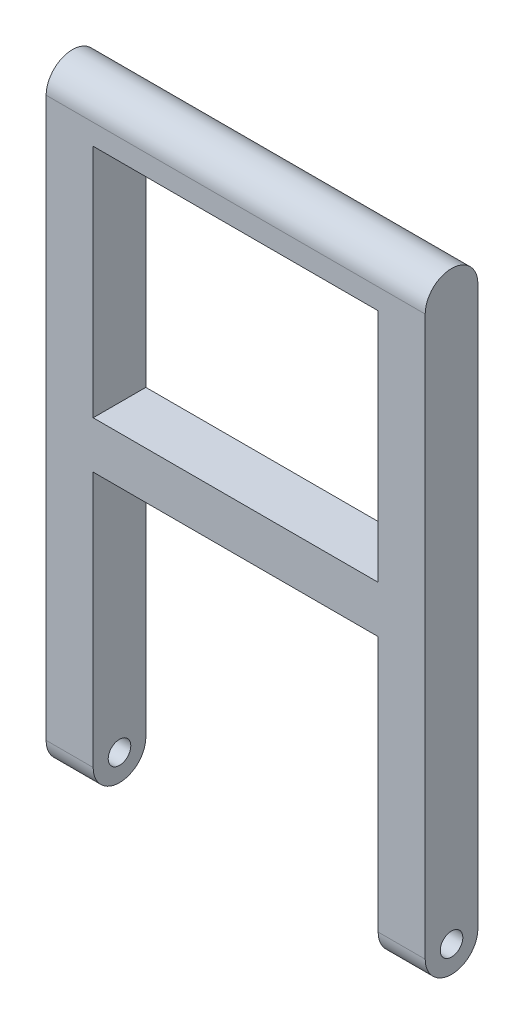
ISO-10303-21;
HEADER;
FILE_DESCRIPTION(('STEP AP214'),'2;1');
FILE_NAME('part.step','',(''),(''),'','','');
FILE_SCHEMA(('AUTOMOTIVE_DESIGN { 1 0 10303 214 1 1 1 1 }'));
ENDSEC;
DATA;
#1=APPLICATION_CONTEXT('core data for automotive mechanical design processes');
#2=APPLICATION_PROTOCOL_DEFINITION('international standard','automotive_design',2000,#1);
#3=PRODUCT_CONTEXT('',#1,'mechanical');
#4=PRODUCT('Part','Part','',(#3));
#5=PRODUCT_RELATED_PRODUCT_CATEGORY('part','',(#4));
#6=PRODUCT_DEFINITION_FORMATION('','',#4);
#7=PRODUCT_DEFINITION_CONTEXT('part definition',#1,'design');
#8=PRODUCT_DEFINITION('design','',#6,#7);
#9=PRODUCT_DEFINITION_SHAPE('','',#8);
#10=(LENGTH_UNIT() NAMED_UNIT(*) SI_UNIT(.MILLI.,.METRE.));
#11=(NAMED_UNIT(*) PLANE_ANGLE_UNIT() SI_UNIT($,.RADIAN.));
#12=(NAMED_UNIT(*) SI_UNIT($,.STERADIAN.) SOLID_ANGLE_UNIT());
#13=UNCERTAINTY_MEASURE_WITH_UNIT(LENGTH_MEASURE(1.E-05),#10,'distance_accuracy_value','');
#14=(GEOMETRIC_REPRESENTATION_CONTEXT(3) GLOBAL_UNCERTAINTY_ASSIGNED_CONTEXT((#13)) GLOBAL_UNIT_ASSIGNED_CONTEXT((#10,
#11,#12)) REPRESENTATION_CONTEXT('',''));
#15=CARTESIAN_POINT('',(0.,0.,0.));
#16=DIRECTION('',(0.,0.,1.));
#17=DIRECTION('',(1.,0.,0.));
#18=AXIS2_PLACEMENT_3D('',#15,#16,#17);
#19=CARTESIAN_POINT('',(40.3,0.,5.6));
#20=DIRECTION('',(1.,0.,0.));
#21=DIRECTION('',(0.,0.,-1.));
#22=AXIS2_PLACEMENT_3D('',#19,#20,#21);
#23=PLANE('',#22);
#24=CARTESIAN_POINT('',(40.3,2.8,2.8));
#25=DIRECTION('',(-1.,0.,0.));
#26=DIRECTION('',(0.,0.,1.));
#27=AXIS2_PLACEMENT_3D('',#24,#25,#26);
#28=CIRCLE('',#27,1.2);
#29=CARTESIAN_POINT('',(40.3,2.8,4.));
#30=VERTEX_POINT('',#29);
#31=EDGE_CURVE('E322',#30,#30,#28,.T.);
#32=ORIENTED_EDGE('',*,*,#31,.T.);
#33=EDGE_LOOP('',(#32));
#34=FACE_BOUND('',#33,.T.);
#35=DIRECTION('',(0.,-1.,0.));
#36=VECTOR('',#35,1.);
#37=CARTESIAN_POINT('',(40.3,0.,0.));
#38=LINE('',#37,#36);
#39=CARTESIAN_POINT('',(40.3,62.2,0.));
#40=VERTEX_POINT('',#39);
#41=CARTESIAN_POINT('',(40.3,2.8,0.));
#42=VERTEX_POINT('',#41);
#43=EDGE_CURVE('E192',#40,#42,#38,.T.);
#44=ORIENTED_EDGE('',*,*,#43,.F.);
#45=CARTESIAN_POINT('',(40.3,62.2,2.8));
#46=DIRECTION('',(-1.,0.,0.));
#47=DIRECTION('',(0.,0.,1.));
#48=AXIS2_PLACEMENT_3D('',#45,#46,#47);
#49=CIRCLE('',#48,2.8);
#50=CARTESIAN_POINT('',(40.3,62.2,5.6));
#51=VERTEX_POINT('',#50);
#52=EDGE_CURVE('E181',#51,#40,#49,.T.);
#53=ORIENTED_EDGE('',*,*,#52,.F.);
#54=DIRECTION('',(0.,-1.,0.));
#55=VECTOR('',#54,1.);
#56=CARTESIAN_POINT('',(40.3,0.,5.6));
#57=LINE('',#56,#55);
#58=CARTESIAN_POINT('',(40.3,2.8,5.6));
#59=VERTEX_POINT('',#58);
#60=EDGE_CURVE('E116',#51,#59,#57,.T.);
#61=ORIENTED_EDGE('',*,*,#60,.T.);
#62=CARTESIAN_POINT('',(40.3,2.8,2.8));
#63=DIRECTION('',(-1.,0.,0.));
#64=DIRECTION('',(0.,0.,1.));
#65=AXIS2_PLACEMENT_3D('',#62,#63,#64);
#66=CIRCLE('',#65,2.8);
#67=EDGE_CURVE('E196',#42,#59,#66,.T.);
#68=ORIENTED_EDGE('',*,*,#67,.F.);
#69=EDGE_LOOP('',(#44,#53,#61,#68));
#70=FACE_BOUND('',#69,.T.);
#71=ADVANCED_FACE('F93',(#34,#70),#23,.T.);
#72=CARTESIAN_POINT('',(0.,0.,5.6));
#73=DIRECTION('',(-1.,0.,0.));
#74=DIRECTION('',(0.,0.,1.));
#75=AXIS2_PLACEMENT_3D('',#72,#73,#74);
#76=PLANE('',#75);
#77=CARTESIAN_POINT('',(0.,2.8,2.8));
#78=DIRECTION('',(-1.,0.,0.));
#79=DIRECTION('',(0.,0.,1.));
#80=AXIS2_PLACEMENT_3D('',#77,#78,#79);
#81=CIRCLE('',#80,1.2);
#82=CARTESIAN_POINT('',(0.,2.8,4.));
#83=VERTEX_POINT('',#82);
#84=EDGE_CURVE('E325',#83,#83,#81,.T.);
#85=ORIENTED_EDGE('',*,*,#84,.F.);
#86=EDGE_LOOP('',(#85));
#87=FACE_BOUND('',#86,.T.);
#88=CARTESIAN_POINT('',(0.,62.2,2.8));
#89=DIRECTION('',(-1.,0.,0.));
#90=DIRECTION('',(0.,0.,1.));
#91=AXIS2_PLACEMENT_3D('',#88,#89,#90);
#92=CIRCLE('',#91,2.8);
#93=CARTESIAN_POINT('',(0.,62.2,5.6));
#94=VERTEX_POINT('',#93);
#95=CARTESIAN_POINT('',(0.,62.2,0.));
#96=VERTEX_POINT('',#95);
#97=EDGE_CURVE('E108',#94,#96,#92,.T.);
#98=ORIENTED_EDGE('',*,*,#97,.T.);
#99=DIRECTION('',(0.,1.,0.));
#100=VECTOR('',#99,1.);
#101=CARTESIAN_POINT('',(0.,0.,0.));
#102=LINE('',#101,#100);
#103=CARTESIAN_POINT('',(0.,2.8,0.));
#104=VERTEX_POINT('',#103);
#105=EDGE_CURVE('E194',#104,#96,#102,.T.);
#106=ORIENTED_EDGE('',*,*,#105,.F.);
#107=CARTESIAN_POINT('',(0.,2.8,2.8));
#108=DIRECTION('',(-1.,0.,0.));
#109=DIRECTION('',(0.,0.,1.));
#110=AXIS2_PLACEMENT_3D('',#107,#108,#109);
#111=CIRCLE('',#110,2.8);
#112=CARTESIAN_POINT('',(0.,2.8,5.6));
#113=VERTEX_POINT('',#112);
#114=EDGE_CURVE('E231',#104,#113,#111,.T.);
#115=ORIENTED_EDGE('',*,*,#114,.T.);
#116=DIRECTION('',(0.,1.,0.));
#117=VECTOR('',#116,1.);
#118=CARTESIAN_POINT('',(0.,0.,5.6));
#119=LINE('',#118,#117);
#120=EDGE_CURVE('E240',#113,#94,#119,.T.);
#121=ORIENTED_EDGE('',*,*,#120,.T.);
#122=EDGE_LOOP('',(#98,#106,#115,#121));
#123=FACE_BOUND('',#122,.T.);
#124=ADVANCED_FACE('F239',(#87,#123),#76,.T.);
#125=CARTESIAN_POINT('',(0.,0.,0.));
#126=DIRECTION('',(0.,0.,1.));
#127=DIRECTION('',(1.,0.,0.));
#128=AXIS2_PLACEMENT_3D('',#125,#126,#127);
#129=PLANE('',#128);
#130=DIRECTION('',(1.,0.,0.));
#131=VECTOR('',#130,1.);
#132=CARTESIAN_POINT('',(0.,35.,0.));
#133=LINE('',#132,#131);
#134=CARTESIAN_POINT('',(5.00000000000001,35.,0.));
#135=VERTEX_POINT('',#134);
#136=CARTESIAN_POINT('',(35.3,35.,0.));
#137=VERTEX_POINT('',#136);
#138=EDGE_CURVE('E200',#135,#137,#133,.T.);
#139=ORIENTED_EDGE('',*,*,#138,.T.);
#140=DIRECTION('',(0.,1.,0.));
#141=VECTOR('',#140,1.);
#142=CARTESIAN_POINT('',(35.3,0.,0.));
#143=LINE('',#142,#141);
#144=CARTESIAN_POINT('',(35.3,60.,0.));
#145=VERTEX_POINT('',#144);
#146=EDGE_CURVE('E204',#137,#145,#143,.T.);
#147=ORIENTED_EDGE('',*,*,#146,.T.);
#148=DIRECTION('',(-1.,0.,0.));
#149=VECTOR('',#148,1.);
#150=CARTESIAN_POINT('',(0.,60.,0.));
#151=LINE('',#150,#149);
#152=CARTESIAN_POINT('',(5.,60.,0.));
#153=VERTEX_POINT('',#152);
#154=EDGE_CURVE('E210',#145,#153,#151,.T.);
#155=ORIENTED_EDGE('',*,*,#154,.T.);
#156=DIRECTION('',(0.,-1.,0.));
#157=VECTOR('',#156,1.);
#158=CARTESIAN_POINT('',(5.00000000000001,0.,0.));
#159=LINE('',#158,#157);
#160=EDGE_CURVE('E209',#153,#135,#159,.T.);
#161=ORIENTED_EDGE('',*,*,#160,.T.);
#162=EDGE_LOOP('',(#139,#147,#155,#161));
#163=FACE_BOUND('',#162,.T.);
#164=DIRECTION('',(-1.,0.,0.));
#165=VECTOR('',#164,1.);
#166=CARTESIAN_POINT('',(40.3,62.2,0.));
#167=LINE('',#166,#165);
#168=EDGE_CURVE('E184',#40,#96,#167,.T.);
#169=ORIENTED_EDGE('',*,*,#168,.F.);
#170=ORIENTED_EDGE('',*,*,#43,.T.);
#171=DIRECTION('',(-1.,0.,0.));
#172=VECTOR('',#171,1.);
#173=CARTESIAN_POINT('',(40.3,2.8,0.));
#174=LINE('',#173,#172);
#175=CARTESIAN_POINT('',(35.3,2.8,0.));
#176=VERTEX_POINT('',#175);
#177=EDGE_CURVE('E324',#42,#176,#174,.T.);
#178=ORIENTED_EDGE('',*,*,#177,.T.);
#179=CARTESIAN_POINT('',(35.3,30.,0.));
#180=VERTEX_POINT('',#179);
#181=EDGE_CURVE('E198',#176,#180,#143,.T.);
#182=ORIENTED_EDGE('',*,*,#181,.T.);
#183=DIRECTION('',(1.,0.,0.));
#184=VECTOR('',#183,1.);
#185=CARTESIAN_POINT('',(0.,30.,0.));
#186=LINE('',#185,#184);
#187=CARTESIAN_POINT('',(5.00000000000001,30.,0.));
#188=VERTEX_POINT('',#187);
#189=EDGE_CURVE('E202',#188,#180,#186,.T.);
#190=ORIENTED_EDGE('',*,*,#189,.F.);
#191=CARTESIAN_POINT('',(5.00000000000001,2.8,0.));
#192=VERTEX_POINT('',#191);
#193=EDGE_CURVE('E256',#188,#192,#159,.T.);
#194=ORIENTED_EDGE('',*,*,#193,.T.);
#195=DIRECTION('',(-1.,0.,0.));
#196=VECTOR('',#195,1.);
#197=CARTESIAN_POINT('',(40.3,2.8,0.));
#198=LINE('',#197,#196);
#199=EDGE_CURVE('E12',#192,#104,#198,.T.);
#200=ORIENTED_EDGE('',*,*,#199,.T.);
#201=ORIENTED_EDGE('',*,*,#105,.T.);
#202=EDGE_LOOP('',(#169,#170,#178,#182,#190,#194,#200,#201));
#203=FACE_BOUND('',#202,.T.);
#204=ADVANCED_FACE('F190',(#163,#203),#129,.F.);
#205=CARTESIAN_POINT('',(0.,0.,5.6));
#206=DIRECTION('',(0.,0.,1.));
#207=DIRECTION('',(1.,0.,0.));
#208=AXIS2_PLACEMENT_3D('',#205,#206,#207);
#209=PLANE('',#208);
#210=DIRECTION('',(1.,0.,0.));
#211=VECTOR('',#210,1.);
#212=CARTESIAN_POINT('',(0.,35.,5.6));
#213=LINE('',#212,#211);
#214=CARTESIAN_POINT('',(5.00000000000001,35.,5.6));
#215=VERTEX_POINT('',#214);
#216=CARTESIAN_POINT('',(35.3,35.,5.6));
#217=VERTEX_POINT('',#216);
#218=EDGE_CURVE('E244',#215,#217,#213,.T.);
#219=ORIENTED_EDGE('',*,*,#218,.F.);
#220=DIRECTION('',(0.,-1.,0.));
#221=VECTOR('',#220,1.);
#222=CARTESIAN_POINT('',(5.00000000000001,0.,5.6));
#223=LINE('',#222,#221);
#224=CARTESIAN_POINT('',(5.,60.,5.6));
#225=VERTEX_POINT('',#224);
#226=EDGE_CURVE('E247',#225,#215,#223,.T.);
#227=ORIENTED_EDGE('',*,*,#226,.F.);
#228=DIRECTION('',(-1.,0.,0.));
#229=VECTOR('',#228,1.);
#230=CARTESIAN_POINT('',(0.,60.,5.6));
#231=LINE('',#230,#229);
#232=CARTESIAN_POINT('',(35.3,60.,5.6));
#233=VERTEX_POINT('',#232);
#234=EDGE_CURVE('E253',#233,#225,#231,.T.);
#235=ORIENTED_EDGE('',*,*,#234,.F.);
#236=DIRECTION('',(0.,1.,0.));
#237=VECTOR('',#236,1.);
#238=CARTESIAN_POINT('',(35.3,0.,5.6));
#239=LINE('',#238,#237);
#240=EDGE_CURVE('E225',#217,#233,#239,.T.);
#241=ORIENTED_EDGE('',*,*,#240,.F.);
#242=EDGE_LOOP('',(#219,#227,#235,#241));
#243=FACE_BOUND('',#242,.T.);
#244=ORIENTED_EDGE('',*,*,#60,.F.);
#245=DIRECTION('',(-1.,0.,0.));
#246=VECTOR('',#245,1.);
#247=CARTESIAN_POINT('',(40.3,62.2,5.6));
#248=LINE('',#247,#246);
#249=EDGE_CURVE('E186',#51,#94,#248,.T.);
#250=ORIENTED_EDGE('',*,*,#249,.T.);
#251=ORIENTED_EDGE('',*,*,#120,.F.);
#252=DIRECTION('',(-1.,0.,0.));
#253=VECTOR('',#252,1.);
#254=CARTESIAN_POINT('',(40.3,2.8,5.6));
#255=LINE('',#254,#253);
#256=CARTESIAN_POINT('',(5.00000000000001,2.8,5.6));
#257=VERTEX_POINT('',#256);
#258=EDGE_CURVE('E101',#257,#113,#255,.T.);
#259=ORIENTED_EDGE('',*,*,#258,.F.);
#260=CARTESIAN_POINT('',(5.00000000000001,30.,5.6));
#261=VERTEX_POINT('',#260);
#262=EDGE_CURVE('E267',#261,#257,#223,.T.);
#263=ORIENTED_EDGE('',*,*,#262,.F.);
#264=DIRECTION('',(1.,0.,0.));
#265=VECTOR('',#264,1.);
#266=CARTESIAN_POINT('',(0.,30.,5.6));
#267=LINE('',#266,#265);
#268=CARTESIAN_POINT('',(35.3,30.,5.6));
#269=VERTEX_POINT('',#268);
#270=EDGE_CURVE('E276',#261,#269,#267,.T.);
#271=ORIENTED_EDGE('',*,*,#270,.T.);
#272=CARTESIAN_POINT('',(35.3,2.8,5.6));
#273=VERTEX_POINT('',#272);
#274=EDGE_CURVE('E249',#273,#269,#239,.T.);
#275=ORIENTED_EDGE('',*,*,#274,.F.);
#276=DIRECTION('',(-1.,0.,0.));
#277=VECTOR('',#276,1.);
#278=CARTESIAN_POINT('',(40.3,2.8,5.6));
#279=LINE('',#278,#277);
#280=EDGE_CURVE('E271',#59,#273,#279,.T.);
#281=ORIENTED_EDGE('',*,*,#280,.F.);
#282=EDGE_LOOP('',(#244,#250,#251,#259,#263,#271,#275,#281));
#283=FACE_BOUND('',#282,.T.);
#284=ADVANCED_FACE('F243',(#243,#283),#209,.T.);
#285=CARTESIAN_POINT('',(5.00000000000001,0.,5.6));
#286=DIRECTION('',(1.,0.,0.));
#287=DIRECTION('',(0.,1.,0.));
#288=AXIS2_PLACEMENT_3D('',#285,#286,#287);
#289=PLANE('',#288);
#290=CARTESIAN_POINT('',(5.00000000000001,2.8,2.8));
#291=DIRECTION('',(1.,0.,0.));
#292=DIRECTION('',(0.,1.,0.));
#293=AXIS2_PLACEMENT_3D('',#290,#291,#292);
#294=CIRCLE('',#293,1.2);
#295=CARTESIAN_POINT('',(5.00000000000001,4.,2.8));
#296=VERTEX_POINT('',#295);
#297=EDGE_CURVE('E241',#296,#296,#294,.T.);
#298=ORIENTED_EDGE('',*,*,#297,.F.);
#299=EDGE_LOOP('',(#298));
#300=FACE_BOUND('',#299,.T.);
#301=CARTESIAN_POINT('',(5.00000000000001,2.8,2.8));
#302=DIRECTION('',(1.,0.,0.));
#303=DIRECTION('',(0.,1.,0.));
#304=AXIS2_PLACEMENT_3D('',#301,#302,#303);
#305=CIRCLE('',#304,2.8);
#306=EDGE_CURVE('E232',#257,#192,#305,.T.);
#307=ORIENTED_EDGE('',*,*,#306,.T.);
#308=ORIENTED_EDGE('',*,*,#193,.F.);
#309=DIRECTION('',(0.,0.,-1.));
#310=VECTOR('',#309,1.);
#311=CARTESIAN_POINT('',(5.00000000000001,30.,5.6));
#312=LINE('',#311,#310);
#313=EDGE_CURVE('E216',#261,#188,#312,.T.);
#314=ORIENTED_EDGE('',*,*,#313,.F.);
#315=ORIENTED_EDGE('',*,*,#262,.T.);
#316=EDGE_LOOP('',(#307,#308,#314,#315));
#317=FACE_BOUND('',#316,.T.);
#318=ADVANCED_FACE('F266',(#300,#317),#289,.T.);
#319=CARTESIAN_POINT('',(35.3,0.,5.6));
#320=DIRECTION('',(-1.,0.,0.));
#321=DIRECTION('',(0.,-1.,0.));
#322=AXIS2_PLACEMENT_3D('',#319,#320,#321);
#323=PLANE('',#322);
#324=CARTESIAN_POINT('',(35.3,2.8,2.8));
#325=DIRECTION('',(-1.,0.,0.));
#326=DIRECTION('',(0.,-1.,0.));
#327=AXIS2_PLACEMENT_3D('',#324,#325,#326);
#328=CIRCLE('',#327,1.2);
#329=CARTESIAN_POINT('',(35.3,1.6,2.8));
#330=VERTEX_POINT('',#329);
#331=EDGE_CURVE('E327',#330,#330,#328,.T.);
#332=ORIENTED_EDGE('',*,*,#331,.F.);
#333=EDGE_LOOP('',(#332));
#334=FACE_BOUND('',#333,.T.);
#335=ORIENTED_EDGE('',*,*,#181,.F.);
#336=CARTESIAN_POINT('',(35.3,2.8,2.8));
#337=DIRECTION('',(-1.,0.,0.));
#338=DIRECTION('',(0.,-1.,0.));
#339=AXIS2_PLACEMENT_3D('',#336,#337,#338);
#340=CIRCLE('',#339,2.8);
#341=EDGE_CURVE('E268',#176,#273,#340,.T.);
#342=ORIENTED_EDGE('',*,*,#341,.T.);
#343=ORIENTED_EDGE('',*,*,#274,.T.);
#344=DIRECTION('',(0.,0.,-1.));
#345=VECTOR('',#344,1.);
#346=CARTESIAN_POINT('',(35.3,30.,5.6));
#347=LINE('',#346,#345);
#348=EDGE_CURVE('E222',#269,#180,#347,.T.);
#349=ORIENTED_EDGE('',*,*,#348,.T.);
#350=EDGE_LOOP('',(#335,#342,#343,#349));
#351=FACE_BOUND('',#350,.T.);
#352=ADVANCED_FACE('F309',(#334,#351),#323,.T.);
#353=CARTESIAN_POINT('',(0.,35.,5.6));
#354=DIRECTION('',(0.,1.,0.));
#355=DIRECTION('',(0.,0.,1.));
#356=AXIS2_PLACEMENT_3D('',#353,#354,#355);
#357=PLANE('',#356);
#358=ORIENTED_EDGE('',*,*,#138,.F.);
#359=DIRECTION('',(0.,0.,-1.));
#360=VECTOR('',#359,1.);
#361=CARTESIAN_POINT('',(5.00000000000001,35.,5.6));
#362=LINE('',#361,#360);
#363=EDGE_CURVE('E220',#215,#135,#362,.T.);
#364=ORIENTED_EDGE('',*,*,#363,.F.);
#365=ORIENTED_EDGE('',*,*,#218,.T.);
#366=DIRECTION('',(0.,0.,-1.));
#367=VECTOR('',#366,1.);
#368=CARTESIAN_POINT('',(35.3,35.,5.6));
#369=LINE('',#368,#367);
#370=EDGE_CURVE('E213',#217,#137,#369,.T.);
#371=ORIENTED_EDGE('',*,*,#370,.T.);
#372=EDGE_LOOP('',(#358,#364,#365,#371));
#373=FACE_BOUND('',#372,.T.);
#374=ADVANCED_FACE('F299',(#373),#357,.T.);
#375=ORIENTED_EDGE('',*,*,#160,.F.);
#376=DIRECTION('',(0.,0.,-1.));
#377=VECTOR('',#376,1.);
#378=CARTESIAN_POINT('',(5.,60.,5.6));
#379=LINE('',#378,#377);
#380=EDGE_CURVE('E218',#225,#153,#379,.T.);
#381=ORIENTED_EDGE('',*,*,#380,.F.);
#382=ORIENTED_EDGE('',*,*,#226,.T.);
#383=ORIENTED_EDGE('',*,*,#363,.T.);
#384=EDGE_LOOP('',(#375,#381,#382,#383));
#385=FACE_BOUND('',#384,.T.);
#386=ADVANCED_FACE('F301',(#385),#289,.T.);
#387=CARTESIAN_POINT('',(0.,60.,5.6));
#388=DIRECTION('',(0.,-1.,0.));
#389=DIRECTION('',(1.,0.,0.));
#390=AXIS2_PLACEMENT_3D('',#387,#388,#389);
#391=PLANE('',#390);
#392=ORIENTED_EDGE('',*,*,#154,.F.);
#393=DIRECTION('',(0.,0.,-1.));
#394=VECTOR('',#393,1.);
#395=CARTESIAN_POINT('',(35.3,60.,5.6));
#396=LINE('',#395,#394);
#397=EDGE_CURVE('E215',#233,#145,#396,.T.);
#398=ORIENTED_EDGE('',*,*,#397,.F.);
#399=ORIENTED_EDGE('',*,*,#234,.T.);
#400=ORIENTED_EDGE('',*,*,#380,.T.);
#401=EDGE_LOOP('',(#392,#398,#399,#400));
#402=FACE_BOUND('',#401,.T.);
#403=ADVANCED_FACE('F292',(#402),#391,.T.);
#404=CARTESIAN_POINT('',(0.,30.,5.6));
#405=DIRECTION('',(0.,1.,0.));
#406=DIRECTION('',(0.,0.,1.));
#407=AXIS2_PLACEMENT_3D('',#404,#405,#406);
#408=PLANE('',#407);
#409=ORIENTED_EDGE('',*,*,#189,.T.);
#410=ORIENTED_EDGE('',*,*,#348,.F.);
#411=ORIENTED_EDGE('',*,*,#270,.F.);
#412=ORIENTED_EDGE('',*,*,#313,.T.);
#413=EDGE_LOOP('',(#409,#410,#411,#412));
#414=FACE_BOUND('',#413,.T.);
#415=ADVANCED_FACE('F95',(#414),#408,.F.);
#416=ORIENTED_EDGE('',*,*,#146,.F.);
#417=ORIENTED_EDGE('',*,*,#370,.F.);
#418=ORIENTED_EDGE('',*,*,#240,.T.);
#419=ORIENTED_EDGE('',*,*,#397,.T.);
#420=EDGE_LOOP('',(#416,#417,#418,#419));
#421=FACE_BOUND('',#420,.T.);
#422=ADVANCED_FACE('F284',(#421),#323,.T.);
#423=CARTESIAN_POINT('',(40.3,2.8,2.8));
#424=DIRECTION('',(-1.,0.,0.));
#425=DIRECTION('',(0.,0.,1.));
#426=AXIS2_PLACEMENT_3D('',#423,#424,#425);
#427=CYLINDRICAL_SURFACE('',#426,2.8);
#428=ORIENTED_EDGE('',*,*,#258,.T.);
#429=ORIENTED_EDGE('',*,*,#114,.F.);
#430=ORIENTED_EDGE('',*,*,#199,.F.);
#431=ORIENTED_EDGE('',*,*,#306,.F.);
#432=EDGE_LOOP('',(#428,#429,#430,#431));
#433=FACE_BOUND('',#432,.T.);
#434=ADVANCED_FACE('F229',(#433),#427,.T.);
#435=ORIENTED_EDGE('',*,*,#341,.F.);
#436=ORIENTED_EDGE('',*,*,#177,.F.);
#437=ORIENTED_EDGE('',*,*,#67,.T.);
#438=ORIENTED_EDGE('',*,*,#280,.T.);
#439=EDGE_LOOP('',(#435,#436,#437,#438));
#440=FACE_BOUND('',#439,.T.);
#441=ADVANCED_FACE('F340',(#440),#427,.T.);
#442=CARTESIAN_POINT('',(40.3,2.8,2.8));
#443=DIRECTION('',(-1.,0.,0.));
#444=DIRECTION('',(0.,0.,1.));
#445=AXIS2_PLACEMENT_3D('',#442,#443,#444);
#446=CYLINDRICAL_SURFACE('',#445,1.2);
#447=ORIENTED_EDGE('',*,*,#297,.T.);
#448=EDGE_LOOP('',(#447));
#449=FACE_BOUND('',#448,.T.);
#450=ORIENTED_EDGE('',*,*,#84,.T.);
#451=EDGE_LOOP('',(#450));
#452=FACE_BOUND('',#451,.T.);
#453=ADVANCED_FACE('F415',(#449,#452),#446,.F.);
#454=ORIENTED_EDGE('',*,*,#331,.T.);
#455=EDGE_LOOP('',(#454));
#456=FACE_BOUND('',#455,.T.);
#457=ORIENTED_EDGE('',*,*,#31,.F.);
#458=EDGE_LOOP('',(#457));
#459=FACE_BOUND('',#458,.T.);
#460=ADVANCED_FACE('F425',(#456,#459),#446,.F.);
#461=CARTESIAN_POINT('',(40.3,62.2,2.8));
#462=DIRECTION('',(-1.,0.,0.));
#463=DIRECTION('',(0.,0.,1.));
#464=AXIS2_PLACEMENT_3D('',#461,#462,#463);
#465=CYLINDRICAL_SURFACE('',#464,2.8);
#466=ORIENTED_EDGE('',*,*,#97,.F.);
#467=ORIENTED_EDGE('',*,*,#249,.F.);
#468=ORIENTED_EDGE('',*,*,#52,.T.);
#469=ORIENTED_EDGE('',*,*,#168,.T.);
#470=EDGE_LOOP('',(#466,#467,#468,#469));
#471=FACE_BOUND('',#470,.T.);
#472=ADVANCED_FACE('F183',(#471),#465,.T.);
#473=CLOSED_SHELL('',(#71,#124,#204,#284,#318,#352,#374,#386,#403,#415,#422,#434,#441,#453,#460,#472));
#474=MANIFOLD_SOLID_BREP('B2',#473);
#475=ADVANCED_BREP_SHAPE_REPRESENTATION('',(#18,#474),#14);
#476=SHAPE_DEFINITION_REPRESENTATION(#9,#475);
ENDSEC;
END-ISO-10303-21;
